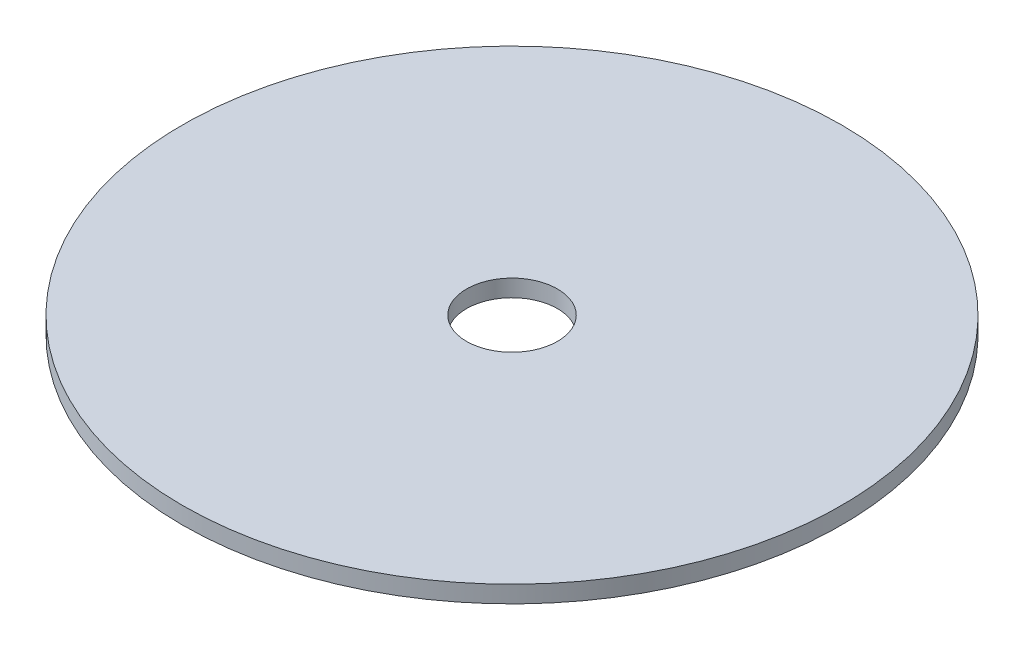
ISO-10303-21;
HEADER;
FILE_DESCRIPTION(('STEP AP214'),'2;1');
FILE_NAME('part.step','',(''),(''),'','','');
FILE_SCHEMA(('AUTOMOTIVE_DESIGN { 1 0 10303 214 1 1 1 1 }'));
ENDSEC;
DATA;
#1=APPLICATION_CONTEXT('core data for automotive mechanical design processes');
#2=APPLICATION_PROTOCOL_DEFINITION('international standard','automotive_design',2000,#1);
#3=PRODUCT_CONTEXT('',#1,'mechanical');
#4=PRODUCT('Part','Part','',(#3));
#5=PRODUCT_RELATED_PRODUCT_CATEGORY('part','',(#4));
#6=PRODUCT_DEFINITION_FORMATION('','',#4);
#7=PRODUCT_DEFINITION_CONTEXT('part definition',#1,'design');
#8=PRODUCT_DEFINITION('design','',#6,#7);
#9=PRODUCT_DEFINITION_SHAPE('','',#8);
#10=(LENGTH_UNIT() NAMED_UNIT(*) SI_UNIT(.MILLI.,.METRE.));
#11=(NAMED_UNIT(*) PLANE_ANGLE_UNIT() SI_UNIT($,.RADIAN.));
#12=(NAMED_UNIT(*) SI_UNIT($,.STERADIAN.) SOLID_ANGLE_UNIT());
#13=UNCERTAINTY_MEASURE_WITH_UNIT(LENGTH_MEASURE(1.E-05),#10,'distance_accuracy_value','');
#14=(GEOMETRIC_REPRESENTATION_CONTEXT(3) GLOBAL_UNCERTAINTY_ASSIGNED_CONTEXT((#13)) GLOBAL_UNIT_ASSIGNED_CONTEXT((#10,
#11,#12)) REPRESENTATION_CONTEXT('',''));
#15=CARTESIAN_POINT('',(0.,0.,0.));
#16=DIRECTION('',(0.,0.,1.));
#17=DIRECTION('',(1.,0.,0.));
#18=AXIS2_PLACEMENT_3D('',#15,#16,#17);
#19=CARTESIAN_POINT('',(0.,1.5,0.));
#20=DIRECTION('',(0.,1.,0.));
#21=DIRECTION('',(0.,0.,1.));
#22=AXIS2_PLACEMENT_3D('',#19,#20,#21);
#23=PLANE('',#22);
#24=CARTESIAN_POINT('',(0.,1.5,0.));
#25=DIRECTION('',(0.,1.,0.));
#26=DIRECTION('',(0.,0.,1.));
#27=AXIS2_PLACEMENT_3D('',#24,#25,#26);
#28=CIRCLE('',#27,58.);
#29=CARTESIAN_POINT('',(0.,1.5,58.));
#30=VERTEX_POINT('',#29);
#31=EDGE_CURVE('E10',#30,#30,#28,.T.);
#32=ORIENTED_EDGE('',*,*,#31,.T.);
#33=EDGE_LOOP('',(#32));
#34=FACE_BOUND('',#33,.T.);
#35=CARTESIAN_POINT('',(0.,1.5,0.));
#36=DIRECTION('',(0.,1.,0.));
#37=DIRECTION('',(0.,0.,1.));
#38=AXIS2_PLACEMENT_3D('',#35,#36,#37);
#39=CIRCLE('',#38,8.);
#40=CARTESIAN_POINT('',(0.,1.5,8.));
#41=VERTEX_POINT('',#40);
#42=EDGE_CURVE('E42',#41,#41,#39,.T.);
#43=ORIENTED_EDGE('',*,*,#42,.F.);
#44=EDGE_LOOP('',(#43));
#45=FACE_BOUND('',#44,.T.);
#46=ADVANCED_FACE('F31',(#34,#45),#23,.T.);
#47=CARTESIAN_POINT('',(0.,-1.5,0.));
#48=DIRECTION('',(0.,1.,0.));
#49=DIRECTION('',(0.,0.,1.));
#50=AXIS2_PLACEMENT_3D('',#47,#48,#49);
#51=PLANE('',#50);
#52=CARTESIAN_POINT('',(0.,-1.5,0.));
#53=DIRECTION('',(0.,1.,0.));
#54=DIRECTION('',(0.,0.,1.));
#55=AXIS2_PLACEMENT_3D('',#52,#53,#54);
#56=CIRCLE('',#55,58.);
#57=CARTESIAN_POINT('',(0.,-1.5,58.));
#58=VERTEX_POINT('',#57);
#59=EDGE_CURVE('E35',#58,#58,#56,.T.);
#60=ORIENTED_EDGE('',*,*,#59,.F.);
#61=EDGE_LOOP('',(#60));
#62=FACE_BOUND('',#61,.T.);
#63=CARTESIAN_POINT('',(0.,-1.5,0.));
#64=DIRECTION('',(0.,1.,0.));
#65=DIRECTION('',(0.,0.,1.));
#66=AXIS2_PLACEMENT_3D('',#63,#64,#65);
#67=CIRCLE('',#66,8.);
#68=CARTESIAN_POINT('',(0.,-1.5,8.));
#69=VERTEX_POINT('',#68);
#70=EDGE_CURVE('E44',#69,#69,#67,.T.);
#71=ORIENTED_EDGE('',*,*,#70,.T.);
#72=EDGE_LOOP('',(#71));
#73=FACE_BOUND('',#72,.T.);
#74=ADVANCED_FACE('F54',(#62,#73),#51,.F.);
#75=CARTESIAN_POINT('',(0.,1.5,0.));
#76=DIRECTION('',(0.,-1.,0.));
#77=DIRECTION('',(0.,0.,-1.));
#78=AXIS2_PLACEMENT_3D('',#75,#76,#77);
#79=CYLINDRICAL_SURFACE('',#78,58.);
#80=ORIENTED_EDGE('',*,*,#31,.F.);
#81=EDGE_LOOP('',(#80));
#82=FACE_BOUND('',#81,.T.);
#83=ORIENTED_EDGE('',*,*,#59,.T.);
#84=EDGE_LOOP('',(#83));
#85=FACE_BOUND('',#84,.T.);
#86=ADVANCED_FACE('F33',(#82,#85),#79,.T.);
#87=CARTESIAN_POINT('',(0.,1.5,0.));
#88=DIRECTION('',(0.,-1.,0.));
#89=DIRECTION('',(0.,0.,-1.));
#90=AXIS2_PLACEMENT_3D('',#87,#88,#89);
#91=CYLINDRICAL_SURFACE('',#90,8.);
#92=ORIENTED_EDGE('',*,*,#42,.T.);
#93=EDGE_LOOP('',(#92));
#94=FACE_BOUND('',#93,.T.);
#95=ORIENTED_EDGE('',*,*,#70,.F.);
#96=EDGE_LOOP('',(#95));
#97=FACE_BOUND('',#96,.T.);
#98=ADVANCED_FACE('F50',(#94,#97),#91,.F.);
#99=CLOSED_SHELL('',(#46,#74,#86,#98));
#100=MANIFOLD_SOLID_BREP('B2',#99);
#101=ADVANCED_BREP_SHAPE_REPRESENTATION('',(#18,#100),#14);
#102=SHAPE_DEFINITION_REPRESENTATION(#9,#101);
ENDSEC;
END-ISO-10303-21;
